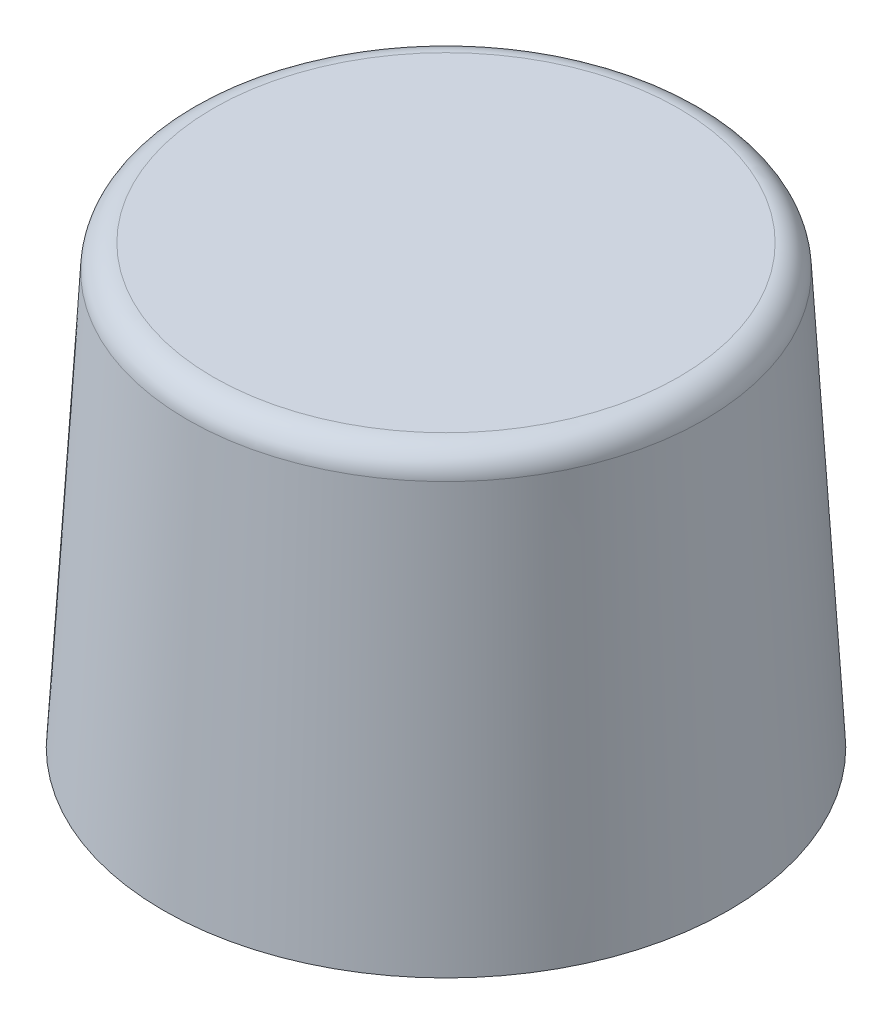
ISO-10303-21;
HEADER;
FILE_DESCRIPTION(('STEP AP214'),'2;1');
FILE_NAME('part.step','',(''),(''),'','','');
FILE_SCHEMA(('AUTOMOTIVE_DESIGN { 1 0 10303 214 1 1 1 1 }'));
ENDSEC;
DATA;
#1=APPLICATION_CONTEXT('core data for automotive mechanical design processes');
#2=APPLICATION_PROTOCOL_DEFINITION('international standard','automotive_design',2000,#1);
#3=PRODUCT_CONTEXT('',#1,'mechanical');
#4=PRODUCT('Part','Part','',(#3));
#5=PRODUCT_RELATED_PRODUCT_CATEGORY('part','',(#4));
#6=PRODUCT_DEFINITION_FORMATION('','',#4);
#7=PRODUCT_DEFINITION_CONTEXT('part definition',#1,'design');
#8=PRODUCT_DEFINITION('design','',#6,#7);
#9=PRODUCT_DEFINITION_SHAPE('','',#8);
#10=(LENGTH_UNIT() NAMED_UNIT(*) SI_UNIT(.MILLI.,.METRE.));
#11=(NAMED_UNIT(*) PLANE_ANGLE_UNIT() SI_UNIT($,.RADIAN.));
#12=(NAMED_UNIT(*) SI_UNIT($,.STERADIAN.) SOLID_ANGLE_UNIT());
#13=UNCERTAINTY_MEASURE_WITH_UNIT(LENGTH_MEASURE(1.E-05),#10,'distance_accuracy_value','');
#14=(GEOMETRIC_REPRESENTATION_CONTEXT(3) GLOBAL_UNCERTAINTY_ASSIGNED_CONTEXT((#13)) GLOBAL_UNIT_ASSIGNED_CONTEXT((#10,
#11,#12)) REPRESENTATION_CONTEXT('',''));
#15=CARTESIAN_POINT('',(0.,0.,0.));
#16=DIRECTION('',(0.,0.,1.));
#17=DIRECTION('',(1.,0.,0.));
#18=AXIS2_PLACEMENT_3D('',#15,#16,#17);
#19=CARTESIAN_POINT('',(0.,16.,0.));
#20=DIRECTION('',(0.,-1.,0.));
#21=DIRECTION('',(1.,0.,0.));
#22=AXIS2_PLACEMENT_3D('',#19,#20,#21);
#23=TOROIDAL_SURFACE('',#22,9.05709491965139,1.);
#24=CARTESIAN_POINT('',(0.,17.,0.));
#25=DIRECTION('',(0.,-1.,0.));
#26=DIRECTION('',(1.,0.,0.));
#27=AXIS2_PLACEMENT_3D('',#24,#25,#26);
#28=CIRCLE('',#27,9.05709491965139);
#29=CARTESIAN_POINT('',(9.05709491965139,17.,0.));
#30=VERTEX_POINT('',#29);
#31=EDGE_CURVE('E41',#30,#30,#28,.F.);
#32=ORIENTED_EDGE('',*,*,#31,.F.);
#33=EDGE_LOOP('',(#32));
#34=FACE_BOUND('',#33,.T.);
#35=CARTESIAN_POINT('',(0.,16.0587220219515,0.));
#36=DIRECTION('',(0.,1.,0.));
#37=DIRECTION('',(-1.,0.,0.));
#38=AXIS2_PLACEMENT_3D('',#35,#36,#37);
#39=CIRCLE('',#38,10.0553692928264);
#40=CARTESIAN_POINT('',(-10.0553692928264,16.0587220219515,0.));
#41=VERTEX_POINT('',#40);
#42=EDGE_CURVE('E10',#41,#41,#39,.F.);
#43=ORIENTED_EDGE('',*,*,#42,.F.);
#44=EDGE_LOOP('',(#43));
#45=FACE_BOUND('',#44,.T.);
#46=ADVANCED_FACE('F35',(#34,#45),#23,.T.);
#47=CARTESIAN_POINT('',(0.,0.,0.));
#48=DIRECTION('',(0.,1.,0.));
#49=DIRECTION('',(-1.,0.,0.));
#50=AXIS2_PLACEMENT_3D('',#47,#48,#49);
#51=PLANE('',#50);
#52=CARTESIAN_POINT('',(0.,0.,0.));
#53=DIRECTION('',(0.,-1.,0.));
#54=DIRECTION('',(1.,0.,0.));
#55=AXIS2_PLACEMENT_3D('',#52,#53,#54);
#56=CIRCLE('',#55,3.);
#57=CARTESIAN_POINT('',(3.,0.,0.));
#58=VERTEX_POINT('',#57);
#59=EDGE_CURVE('E52',#58,#58,#56,.T.);
#60=ORIENTED_EDGE('',*,*,#59,.F.);
#61=EDGE_LOOP('',(#60));
#62=FACE_BOUND('',#61,.T.);
#63=CARTESIAN_POINT('',(0.,0.,0.));
#64=DIRECTION('',(0.,1.,0.));
#65=DIRECTION('',(-1.,0.,0.));
#66=AXIS2_PLACEMENT_3D('',#63,#64,#65);
#67=CIRCLE('',#66,11.);
#68=CARTESIAN_POINT('',(-11.,0.,0.));
#69=VERTEX_POINT('',#68);
#70=EDGE_CURVE('E45',#69,#69,#67,.T.);
#71=ORIENTED_EDGE('',*,*,#70,.F.);
#72=EDGE_LOOP('',(#71));
#73=FACE_BOUND('',#72,.T.);
#74=ADVANCED_FACE('F67',(#62,#73),#51,.F.);
#75=CARTESIAN_POINT('',(0.,0.,0.));
#76=DIRECTION('',(0.,-1.,0.));
#77=DIRECTION('',(1.,0.,0.));
#78=AXIS2_PLACEMENT_3D('',#75,#76,#77);
#79=CONICAL_SURFACE('',#78,11.,0.0587558227157226);
#80=ORIENTED_EDGE('',*,*,#42,.T.);
#81=EDGE_LOOP('',(#80));
#82=FACE_BOUND('',#81,.T.);
#83=ORIENTED_EDGE('',*,*,#70,.T.);
#84=EDGE_LOOP('',(#83));
#85=FACE_BOUND('',#84,.T.);
#86=ADVANCED_FACE('F70',(#82,#85),#79,.T.);
#87=CARTESIAN_POINT('',(10.,17.,0.));
#88=DIRECTION('',(0.,-1.,0.));
#89=DIRECTION('',(1.,0.,0.));
#90=AXIS2_PLACEMENT_3D('',#87,#88,#89);
#91=PLANE('',#90);
#92=ORIENTED_EDGE('',*,*,#31,.T.);
#93=EDGE_LOOP('',(#92));
#94=FACE_BOUND('',#93,.T.);
#95=ADVANCED_FACE('F63',(#94),#91,.F.);
#96=CARTESIAN_POINT('',(0.,15.,0.));
#97=DIRECTION('',(0.,-1.,0.));
#98=DIRECTION('',(1.,0.,0.));
#99=AXIS2_PLACEMENT_3D('',#96,#97,#98);
#100=CYLINDRICAL_SURFACE('',#99,3.);
#101=CARTESIAN_POINT('',(0.,15.,0.));
#102=DIRECTION('',(0.,-1.,0.));
#103=DIRECTION('',(1.,0.,0.));
#104=AXIS2_PLACEMENT_3D('',#101,#102,#103);
#105=CIRCLE('',#104,3.);
#106=CARTESIAN_POINT('',(3.,15.,0.));
#107=VERTEX_POINT('',#106);
#108=EDGE_CURVE('E49',#107,#107,#105,.T.);
#109=ORIENTED_EDGE('',*,*,#108,.F.);
#110=EDGE_LOOP('',(#109));
#111=FACE_BOUND('',#110,.T.);
#112=ORIENTED_EDGE('',*,*,#59,.T.);
#113=EDGE_LOOP('',(#112));
#114=FACE_BOUND('',#113,.T.);
#115=ADVANCED_FACE('F60',(#111,#114),#100,.F.);
#116=CARTESIAN_POINT('',(0.,15.,0.));
#117=DIRECTION('',(0.,-1.,0.));
#118=DIRECTION('',(1.,0.,0.));
#119=AXIS2_PLACEMENT_3D('',#116,#117,#118);
#120=PLANE('',#119);
#121=ORIENTED_EDGE('',*,*,#108,.T.);
#122=EDGE_LOOP('',(#121));
#123=FACE_BOUND('',#122,.T.);
#124=ADVANCED_FACE('F58',(#123),#120,.T.);
#125=CLOSED_SHELL('',(#46,#74,#86,#95,#115,#124));
#126=MANIFOLD_SOLID_BREP('B2',#125);
#127=ADVANCED_BREP_SHAPE_REPRESENTATION('',(#18,#126),#14);
#128=SHAPE_DEFINITION_REPRESENTATION(#9,#127);
ENDSEC;
END-ISO-10303-21;
